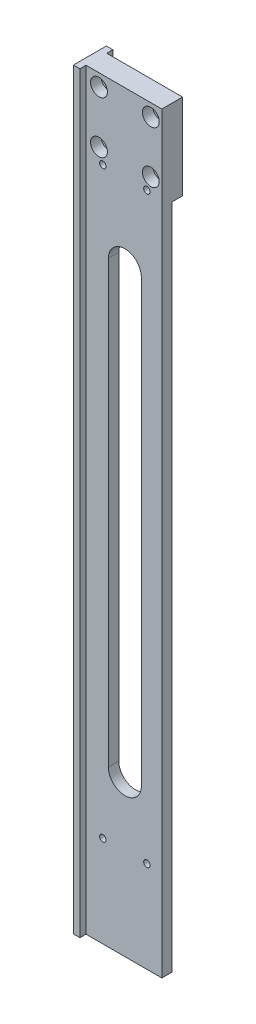
ISO-10303-21;
HEADER;
FILE_DESCRIPTION(('STEP AP214'),'2;1');
FILE_NAME('part.step','',(''),(''),'','','');
FILE_SCHEMA(('AUTOMOTIVE_DESIGN { 1 0 10303 214 1 1 1 1 }'));
ENDSEC;
DATA;
#1=APPLICATION_CONTEXT('core data for automotive mechanical design processes');
#2=APPLICATION_PROTOCOL_DEFINITION('international standard','automotive_design',2000,#1);
#3=PRODUCT_CONTEXT('',#1,'mechanical');
#4=PRODUCT('Part','Part','',(#3));
#5=PRODUCT_RELATED_PRODUCT_CATEGORY('part','',(#4));
#6=PRODUCT_DEFINITION_FORMATION('','',#4);
#7=PRODUCT_DEFINITION_CONTEXT('part definition',#1,'design');
#8=PRODUCT_DEFINITION('design','',#6,#7);
#9=PRODUCT_DEFINITION_SHAPE('','',#8);
#10=(LENGTH_UNIT() NAMED_UNIT(*) SI_UNIT(.MILLI.,.METRE.));
#11=(NAMED_UNIT(*) PLANE_ANGLE_UNIT() SI_UNIT($,.RADIAN.));
#12=(NAMED_UNIT(*) SI_UNIT($,.STERADIAN.) SOLID_ANGLE_UNIT());
#13=UNCERTAINTY_MEASURE_WITH_UNIT(LENGTH_MEASURE(1.E-05),#10,'distance_accuracy_value','');
#14=(GEOMETRIC_REPRESENTATION_CONTEXT(3) GLOBAL_UNCERTAINTY_ASSIGNED_CONTEXT((#13)) GLOBAL_UNIT_ASSIGNED_CONTEXT((#10,
#11,#12)) REPRESENTATION_CONTEXT('',''));
#15=CARTESIAN_POINT('',(0.,0.,0.));
#16=DIRECTION('',(0.,0.,1.));
#17=DIRECTION('',(1.,0.,0.));
#18=AXIS2_PLACEMENT_3D('',#15,#16,#17);
#19=CARTESIAN_POINT('',(0.,-145.15,8.));
#20=DIRECTION('',(0.,1.,0.));
#21=DIRECTION('',(0.,0.,1.));
#22=AXIS2_PLACEMENT_3D('',#19,#20,#21);
#23=PLANE('',#22);
#24=DIRECTION('',(0.,0.,-1.));
#25=VECTOR('',#24,1.);
#26=CARTESIAN_POINT('',(-17.5,-145.15,303.010764526567));
#27=LINE('',#26,#25);
#28=CARTESIAN_POINT('',(-17.5,-145.15,10.35));
#29=VERTEX_POINT('',#28);
#30=CARTESIAN_POINT('',(-17.5,-145.15,4.));
#31=VERTEX_POINT('',#30);
#32=EDGE_CURVE('E280',#29,#31,#27,.T.);
#33=ORIENTED_EDGE('',*,*,#32,.T.);
#34=DIRECTION('',(-1.,0.,0.));
#35=VECTOR('',#34,1.);
#36=CARTESIAN_POINT('',(14.25,-145.15,4.));
#37=LINE('',#36,#35);
#38=CARTESIAN_POINT('',(14.25,-145.15,4.));
#39=VERTEX_POINT('',#38);
#40=EDGE_CURVE('E151',#39,#31,#37,.T.);
#41=ORIENTED_EDGE('',*,*,#40,.F.);
#42=DIRECTION('',(0.,0.,1.));
#43=VECTOR('',#42,1.);
#44=CARTESIAN_POINT('',(14.25,-145.15,-2.35));
#45=LINE('',#44,#43);
#46=CARTESIAN_POINT('',(14.25,-145.15,8.));
#47=VERTEX_POINT('',#46);
#48=EDGE_CURVE('E189',#39,#47,#45,.T.);
#49=ORIENTED_EDGE('',*,*,#48,.T.);
#50=DIRECTION('',(1.,0.,0.));
#51=VECTOR('',#50,1.);
#52=CARTESIAN_POINT('',(0.,-145.15,8.));
#53=LINE('',#52,#51);
#54=CARTESIAN_POINT('',(-15.,-145.15,8.));
#55=VERTEX_POINT('',#54);
#56=EDGE_CURVE('E299',#55,#47,#53,.T.);
#57=ORIENTED_EDGE('',*,*,#56,.F.);
#58=DIRECTION('',(0.,0.,-1.));
#59=VECTOR('',#58,1.);
#60=CARTESIAN_POINT('',(-15.,-145.15,303.010764526567));
#61=LINE('',#60,#59);
#62=CARTESIAN_POINT('',(-15.,-145.15,10.35));
#63=VERTEX_POINT('',#62);
#64=EDGE_CURVE('E292',#63,#55,#61,.T.);
#65=ORIENTED_EDGE('',*,*,#64,.F.);
#66=DIRECTION('',(-1.,0.,0.));
#67=VECTOR('',#66,1.);
#68=CARTESIAN_POINT('',(0.,-145.15,10.35));
#69=LINE('',#68,#67);
#70=EDGE_CURVE('E278',#63,#29,#69,.T.);
#71=ORIENTED_EDGE('',*,*,#70,.T.);
#72=EDGE_LOOP('',(#33,#41,#49,#57,#65,#71));
#73=FACE_BOUND('',#72,.T.);
#74=ADVANCED_FACE('F42',(#73),#23,.F.);
#75=CARTESIAN_POINT('',(0.,145.15,8.));
#76=DIRECTION('',(0.,1.,0.));
#77=DIRECTION('',(0.,0.,1.));
#78=AXIS2_PLACEMENT_3D('',#75,#76,#77);
#79=PLANE('',#78);
#80=DIRECTION('',(0.,0.,1.));
#81=VECTOR('',#80,1.);
#82=CARTESIAN_POINT('',(14.25,145.15,-2.35));
#83=LINE('',#82,#81);
#84=CARTESIAN_POINT('',(14.25,145.15,0.));
#85=VERTEX_POINT('',#84);
#86=CARTESIAN_POINT('',(14.25,145.15,8.));
#87=VERTEX_POINT('',#86);
#88=EDGE_CURVE('E188',#85,#87,#83,.T.);
#89=ORIENTED_EDGE('',*,*,#88,.F.);
#90=DIRECTION('',(1.,0.,0.));
#91=VECTOR('',#90,1.);
#92=CARTESIAN_POINT('',(0.,145.15,0.));
#93=LINE('',#92,#91);
#94=CARTESIAN_POINT('',(-15.,145.15,0.));
#95=VERTEX_POINT('',#94);
#96=EDGE_CURVE('E285',#95,#85,#93,.T.);
#97=ORIENTED_EDGE('',*,*,#96,.F.);
#98=DIRECTION('',(0.,0.,1.));
#99=VECTOR('',#98,1.);
#100=CARTESIAN_POINT('',(-15.,145.15,-2.35));
#101=LINE('',#100,#99);
#102=CARTESIAN_POINT('',(-15.,145.15,-2.35));
#103=VERTEX_POINT('',#102);
#104=EDGE_CURVE('E273',#103,#95,#101,.T.);
#105=ORIENTED_EDGE('',*,*,#104,.F.);
#106=DIRECTION('',(-1.,0.,0.));
#107=VECTOR('',#106,1.);
#108=CARTESIAN_POINT('',(-1.61148872024342E-12,145.15,-2.35));
#109=LINE('',#108,#107);
#110=CARTESIAN_POINT('',(-17.5,145.15,-2.35));
#111=VERTEX_POINT('',#110);
#112=EDGE_CURVE('E266',#103,#111,#109,.T.);
#113=ORIENTED_EDGE('',*,*,#112,.T.);
#114=DIRECTION('',(0.,0.,-1.));
#115=VECTOR('',#114,1.);
#116=CARTESIAN_POINT('',(-17.5,145.15,303.010764526567));
#117=LINE('',#116,#115);
#118=CARTESIAN_POINT('',(-17.5,145.15,10.35));
#119=VERTEX_POINT('',#118);
#120=EDGE_CURVE('E281',#119,#111,#117,.T.);
#121=ORIENTED_EDGE('',*,*,#120,.F.);
#122=DIRECTION('',(-1.,0.,0.));
#123=VECTOR('',#122,1.);
#124=CARTESIAN_POINT('',(-1.61148872024342E-12,145.15,10.35));
#125=LINE('',#124,#123);
#126=CARTESIAN_POINT('',(-15.,145.15,10.35));
#127=VERTEX_POINT('',#126);
#128=EDGE_CURVE('E286',#127,#119,#125,.T.);
#129=ORIENTED_EDGE('',*,*,#128,.F.);
#130=DIRECTION('',(0.,0.,-1.));
#131=VECTOR('',#130,1.);
#132=CARTESIAN_POINT('',(-15.,145.15,303.010764526567));
#133=LINE('',#132,#131);
#134=CARTESIAN_POINT('',(-15.,145.15,8.00000000000001));
#135=VERTEX_POINT('',#134);
#136=EDGE_CURVE('E277',#127,#135,#133,.T.);
#137=ORIENTED_EDGE('',*,*,#136,.T.);
#138=DIRECTION('',(1.,0.,0.));
#139=VECTOR('',#138,1.);
#140=CARTESIAN_POINT('',(0.,145.15,8.));
#141=LINE('',#140,#139);
#142=EDGE_CURVE('E302',#135,#87,#141,.T.);
#143=ORIENTED_EDGE('',*,*,#142,.T.);
#144=EDGE_LOOP('',(#89,#97,#105,#113,#121,#129,#137,#143));
#145=FACE_BOUND('',#144,.T.);
#146=ADVANCED_FACE('F331',(#145),#79,.T.);
#147=CARTESIAN_POINT('',(0.,0.,8.));
#148=DIRECTION('',(0.,0.,1.));
#149=DIRECTION('',(1.,0.,0.));
#150=AXIS2_PLACEMENT_3D('',#147,#148,#149);
#151=PLANE('',#150);
#152=DIRECTION('',(0.,-1.,0.));
#153=VECTOR('',#152,1.);
#154=CARTESIAN_POINT('',(14.25,145.15,8.));
#155=LINE('',#154,#153);
#156=EDGE_CURVE('E185',#87,#47,#155,.T.);
#157=ORIENTED_EDGE('',*,*,#156,.F.);
#158=ORIENTED_EDGE('',*,*,#142,.F.);
#159=DIRECTION('',(0.,1.,0.));
#160=VECTOR('',#159,1.);
#161=CARTESIAN_POINT('',(-15.,0.,8.));
#162=LINE('',#161,#160);
#163=EDGE_CURVE('E305',#55,#135,#162,.T.);
#164=ORIENTED_EDGE('',*,*,#163,.F.);
#165=ORIENTED_EDGE('',*,*,#56,.T.);
#166=EDGE_LOOP('',(#157,#158,#164,#165));
#167=FACE_BOUND('',#166,.T.);
#168=CARTESIAN_POINT('',(0.,-85.,8.));
#169=DIRECTION('',(0.,0.,1.));
#170=DIRECTION('',(1.,0.,0.));
#171=AXIS2_PLACEMENT_3D('',#168,#169,#170);
#172=CIRCLE('',#171,6.35000000000003);
#173=CARTESIAN_POINT('',(-6.35000000000003,-85.,8.));
#174=VERTEX_POINT('',#173);
#175=CARTESIAN_POINT('',(6.35000000000003,-85.,8.));
#176=VERTEX_POINT('',#175);
#177=EDGE_CURVE('E191',#174,#176,#172,.T.);
#178=ORIENTED_EDGE('',*,*,#177,.F.);
#179=DIRECTION('',(0.,-1.,0.));
#180=VECTOR('',#179,1.);
#181=CARTESIAN_POINT('',(-6.35000000000003,-85.,8.));
#182=LINE('',#181,#180);
#183=CARTESIAN_POINT('',(-6.35000000000006,85.,8.));
#184=VERTEX_POINT('',#183);
#185=EDGE_CURVE('E201',#184,#174,#182,.T.);
#186=ORIENTED_EDGE('',*,*,#185,.F.);
#187=CARTESIAN_POINT('',(0.,85.,8.));
#188=DIRECTION('',(0.,0.,1.));
#189=DIRECTION('',(1.,0.,0.));
#190=AXIS2_PLACEMENT_3D('',#187,#188,#189);
#191=CIRCLE('',#190,6.35000000000003);
#192=CARTESIAN_POINT('',(6.35,85.,8.));
#193=VERTEX_POINT('',#192);
#194=EDGE_CURVE('E198',#193,#184,#191,.T.);
#195=ORIENTED_EDGE('',*,*,#194,.F.);
#196=DIRECTION('',(0.,1.,0.));
#197=VECTOR('',#196,1.);
#198=CARTESIAN_POINT('',(6.35000000000003,-85.,8.));
#199=LINE('',#198,#197);
#200=EDGE_CURVE('E195',#176,#193,#199,.T.);
#201=ORIENTED_EDGE('',*,*,#200,.F.);
#202=EDGE_LOOP('',(#178,#186,#195,#201));
#203=FACE_BOUND('',#202,.T.);
#204=CARTESIAN_POINT('',(-8.49999999999999,115.15,8.));
#205=DIRECTION('',(0.,0.,1.));
#206=DIRECTION('',(1.,0.,0.));
#207=AXIS2_PLACEMENT_3D('',#204,#205,#206);
#208=CIRCLE('',#207,1.25);
#209=CARTESIAN_POINT('',(-7.25,115.15,8.));
#210=VERTEX_POINT('',#209);
#211=EDGE_CURVE('E207',#210,#210,#208,.T.);
#212=ORIENTED_EDGE('',*,*,#211,.F.);
#213=EDGE_LOOP('',(#212));
#214=FACE_BOUND('',#213,.T.);
#215=CARTESIAN_POINT('',(8.50000000000005,115.15,8.));
#216=DIRECTION('',(0.,0.,1.));
#217=DIRECTION('',(1.,0.,0.));
#218=AXIS2_PLACEMENT_3D('',#215,#216,#217);
#219=CIRCLE('',#218,1.25);
#220=CARTESIAN_POINT('',(9.75000000000005,115.15,8.));
#221=VERTEX_POINT('',#220);
#222=EDGE_CURVE('E216',#221,#221,#219,.T.);
#223=ORIENTED_EDGE('',*,*,#222,.F.);
#224=EDGE_LOOP('',(#223));
#225=FACE_BOUND('',#224,.T.);
#226=CARTESIAN_POINT('',(8.5,-109.85,8.));
#227=DIRECTION('',(0.,0.,1.));
#228=DIRECTION('',(1.,0.,0.));
#229=AXIS2_PLACEMENT_3D('',#226,#227,#228);
#230=CIRCLE('',#229,1.25);
#231=CARTESIAN_POINT('',(9.75,-109.85,8.));
#232=VERTEX_POINT('',#231);
#233=EDGE_CURVE('E220',#232,#232,#230,.T.);
#234=ORIENTED_EDGE('',*,*,#233,.F.);
#235=EDGE_LOOP('',(#234));
#236=FACE_BOUND('',#235,.T.);
#237=CARTESIAN_POINT('',(-8.5,-109.85,8.));
#238=DIRECTION('',(0.,0.,1.));
#239=DIRECTION('',(1.,0.,0.));
#240=AXIS2_PLACEMENT_3D('',#237,#238,#239);
#241=CIRCLE('',#240,1.25);
#242=CARTESIAN_POINT('',(-7.25,-109.85,8.));
#243=VERTEX_POINT('',#242);
#244=EDGE_CURVE('E223',#243,#243,#241,.T.);
#245=ORIENTED_EDGE('',*,*,#244,.F.);
#246=EDGE_LOOP('',(#245));
#247=FACE_BOUND('',#246,.T.);
#248=CARTESIAN_POINT('',(-10.,140.35,8.));
#249=DIRECTION('',(0.,0.,1.));
#250=DIRECTION('',(1.,0.,0.));
#251=AXIS2_PLACEMENT_3D('',#248,#249,#250);
#252=CIRCLE('',#251,3.25);
#253=CARTESIAN_POINT('',(-6.75,140.35,8.));
#254=VERTEX_POINT('',#253);
#255=EDGE_CURVE('E226',#254,#254,#252,.T.);
#256=ORIENTED_EDGE('',*,*,#255,.F.);
#257=EDGE_LOOP('',(#256));
#258=FACE_BOUND('',#257,.T.);
#259=CARTESIAN_POINT('',(10.,140.35,8.));
#260=DIRECTION('',(0.,0.,1.));
#261=DIRECTION('',(1.,0.,0.));
#262=AXIS2_PLACEMENT_3D('',#259,#260,#261);
#263=CIRCLE('',#262,3.25);
#264=CARTESIAN_POINT('',(13.25,140.35,8.));
#265=VERTEX_POINT('',#264);
#266=EDGE_CURVE('E236',#265,#265,#263,.T.);
#267=ORIENTED_EDGE('',*,*,#266,.F.);
#268=EDGE_LOOP('',(#267));
#269=FACE_BOUND('',#268,.T.);
#270=CARTESIAN_POINT('',(10.,120.35,8.));
#271=DIRECTION('',(0.,0.,1.));
#272=DIRECTION('',(1.,0.,0.));
#273=AXIS2_PLACEMENT_3D('',#270,#271,#272);
#274=CIRCLE('',#273,3.25);
#275=CARTESIAN_POINT('',(13.25,120.35,8.));
#276=VERTEX_POINT('',#275);
#277=EDGE_CURVE('E246',#276,#276,#274,.T.);
#278=ORIENTED_EDGE('',*,*,#277,.F.);
#279=EDGE_LOOP('',(#278));
#280=FACE_BOUND('',#279,.T.);
#281=CARTESIAN_POINT('',(-10.,120.35,8.));
#282=DIRECTION('',(0.,0.,1.));
#283=DIRECTION('',(1.,0.,0.));
#284=AXIS2_PLACEMENT_3D('',#281,#282,#283);
#285=CIRCLE('',#284,3.25);
#286=CARTESIAN_POINT('',(-6.75,120.35,8.));
#287=VERTEX_POINT('',#286);
#288=EDGE_CURVE('E256',#287,#287,#285,.T.);
#289=ORIENTED_EDGE('',*,*,#288,.F.);
#290=EDGE_LOOP('',(#289));
#291=FACE_BOUND('',#290,.T.);
#292=ADVANCED_FACE('F336',(#167,#203,#214,#225,#236,#247,#258,#269,#280,#291),#151,.T.);
#293=CARTESIAN_POINT('',(0.,0.,0.));
#294=DIRECTION('',(0.,0.,1.));
#295=DIRECTION('',(1.,0.,0.));
#296=AXIS2_PLACEMENT_3D('',#293,#294,#295);
#297=PLANE('',#296);
#298=CARTESIAN_POINT('',(-8.49999999999999,115.15,0.));
#299=DIRECTION('',(0.,0.,1.));
#300=DIRECTION('',(1.,0.,0.));
#301=AXIS2_PLACEMENT_3D('',#298,#299,#300);
#302=CIRCLE('',#301,1.25);
#303=CARTESIAN_POINT('',(-7.25,115.15,0.));
#304=VERTEX_POINT('',#303);
#305=EDGE_CURVE('E215',#304,#304,#302,.T.);
#306=ORIENTED_EDGE('',*,*,#305,.T.);
#307=EDGE_LOOP('',(#306));
#308=FACE_BOUND('',#307,.T.);
#309=CARTESIAN_POINT('',(8.50000000000005,115.15,0.));
#310=DIRECTION('',(0.,0.,1.));
#311=DIRECTION('',(1.,0.,0.));
#312=AXIS2_PLACEMENT_3D('',#309,#310,#311);
#313=CIRCLE('',#312,1.25);
#314=CARTESIAN_POINT('',(9.75000000000005,115.15,0.));
#315=VERTEX_POINT('',#314);
#316=EDGE_CURVE('E219',#315,#315,#313,.T.);
#317=ORIENTED_EDGE('',*,*,#316,.T.);
#318=EDGE_LOOP('',(#317));
#319=FACE_BOUND('',#318,.T.);
#320=CARTESIAN_POINT('',(-10.,140.35,0.));
#321=DIRECTION('',(0.,0.,1.));
#322=DIRECTION('',(1.,0.,0.));
#323=AXIS2_PLACEMENT_3D('',#320,#321,#322);
#324=CIRCLE('',#323,1.8);
#325=CARTESIAN_POINT('',(-8.2,140.35,0.));
#326=VERTEX_POINT('',#325);
#327=EDGE_CURVE('E235',#326,#326,#324,.T.);
#328=ORIENTED_EDGE('',*,*,#327,.T.);
#329=EDGE_LOOP('',(#328));
#330=FACE_BOUND('',#329,.T.);
#331=CARTESIAN_POINT('',(10.,140.35,0.));
#332=DIRECTION('',(0.,0.,1.));
#333=DIRECTION('',(1.,0.,0.));
#334=AXIS2_PLACEMENT_3D('',#331,#332,#333);
#335=CIRCLE('',#334,1.8);
#336=CARTESIAN_POINT('',(11.8,140.35,0.));
#337=VERTEX_POINT('',#336);
#338=EDGE_CURVE('E245',#337,#337,#335,.T.);
#339=ORIENTED_EDGE('',*,*,#338,.T.);
#340=EDGE_LOOP('',(#339));
#341=FACE_BOUND('',#340,.T.);
#342=CARTESIAN_POINT('',(10.,120.35,0.));
#343=DIRECTION('',(0.,0.,1.));
#344=DIRECTION('',(1.,0.,0.));
#345=AXIS2_PLACEMENT_3D('',#342,#343,#344);
#346=CIRCLE('',#345,1.8);
#347=CARTESIAN_POINT('',(11.8,120.35,0.));
#348=VERTEX_POINT('',#347);
#349=EDGE_CURVE('E255',#348,#348,#346,.T.);
#350=ORIENTED_EDGE('',*,*,#349,.T.);
#351=EDGE_LOOP('',(#350));
#352=FACE_BOUND('',#351,.T.);
#353=CARTESIAN_POINT('',(-10.,120.35,0.));
#354=DIRECTION('',(0.,0.,1.));
#355=DIRECTION('',(1.,0.,0.));
#356=AXIS2_PLACEMENT_3D('',#353,#354,#355);
#357=CIRCLE('',#356,1.8);
#358=CARTESIAN_POINT('',(-8.2,120.35,0.));
#359=VERTEX_POINT('',#358);
#360=EDGE_CURVE('E265',#359,#359,#357,.T.);
#361=ORIENTED_EDGE('',*,*,#360,.T.);
#362=EDGE_LOOP('',(#361));
#363=FACE_BOUND('',#362,.T.);
#364=DIRECTION('',(0.,-1.,0.));
#365=VECTOR('',#364,1.);
#366=CARTESIAN_POINT('',(14.25,0.,0.));
#367=LINE('',#366,#365);
#368=CARTESIAN_POINT('',(14.25,112.15,0.));
#369=VERTEX_POINT('',#368);
#370=EDGE_CURVE('E49',#85,#369,#367,.T.);
#371=ORIENTED_EDGE('',*,*,#370,.T.);
#372=DIRECTION('',(-1.,0.,0.));
#373=VECTOR('',#372,1.);
#374=CARTESIAN_POINT('',(0.,112.15,0.));
#375=LINE('',#374,#373);
#376=CARTESIAN_POINT('',(-15.,112.15,0.));
#377=VERTEX_POINT('',#376);
#378=EDGE_CURVE('E182',#369,#377,#375,.T.);
#379=ORIENTED_EDGE('',*,*,#378,.T.);
#380=DIRECTION('',(0.,1.,0.));
#381=VECTOR('',#380,1.);
#382=CARTESIAN_POINT('',(-15.,0.,0.));
#383=LINE('',#382,#381);
#384=EDGE_CURVE('E269',#377,#95,#383,.T.);
#385=ORIENTED_EDGE('',*,*,#384,.T.);
#386=ORIENTED_EDGE('',*,*,#96,.T.);
#387=EDGE_LOOP('',(#371,#379,#385,#386));
#388=FACE_BOUND('',#387,.T.);
#389=ADVANCED_FACE('F323',(#308,#319,#330,#341,#352,#363,#388),#297,.F.);
#390=CARTESIAN_POINT('',(-15.,0.,303.010764526567));
#391=DIRECTION('',(-1.,0.,0.));
#392=DIRECTION('',(0.,-1.,0.));
#393=AXIS2_PLACEMENT_3D('',#390,#391,#392);
#394=PLANE('',#393);
#395=ORIENTED_EDGE('',*,*,#64,.T.);
#396=ORIENTED_EDGE('',*,*,#163,.T.);
#397=ORIENTED_EDGE('',*,*,#136,.F.);
#398=DIRECTION('',(0.,1.,0.));
#399=VECTOR('',#398,1.);
#400=CARTESIAN_POINT('',(-15.,0.,10.35));
#401=LINE('',#400,#399);
#402=EDGE_CURVE('E289',#63,#127,#401,.T.);
#403=ORIENTED_EDGE('',*,*,#402,.F.);
#404=EDGE_LOOP('',(#395,#396,#397,#403));
#405=FACE_BOUND('',#404,.T.);
#406=ADVANCED_FACE('F339',(#405),#394,.F.);
#407=CARTESIAN_POINT('',(-17.5,0.,303.010764526567));
#408=DIRECTION('',(1.,0.,0.));
#409=DIRECTION('',(0.,1.,0.));
#410=AXIS2_PLACEMENT_3D('',#407,#408,#409);
#411=PLANE('',#410);
#412=DIRECTION('',(0.,-1.,0.));
#413=VECTOR('',#412,1.);
#414=CARTESIAN_POINT('',(-17.5,0.,-2.35));
#415=LINE('',#414,#413);
#416=CARTESIAN_POINT('',(-17.5,112.15,-2.35000000000002));
#417=VERTEX_POINT('',#416);
#418=EDGE_CURVE('E159',#111,#417,#415,.T.);
#419=ORIENTED_EDGE('',*,*,#418,.T.);
#420=DIRECTION('',(0.,0.,1.));
#421=VECTOR('',#420,1.);
#422=CARTESIAN_POINT('',(-17.5,112.15,-261.601523621367));
#423=LINE('',#422,#421);
#424=CARTESIAN_POINT('',(-17.5,112.15,4.));
#425=VERTEX_POINT('',#424);
#426=EDGE_CURVE('E142',#417,#425,#423,.T.);
#427=ORIENTED_EDGE('',*,*,#426,.T.);
#428=DIRECTION('',(0.,1.,0.));
#429=VECTOR('',#428,1.);
#430=CARTESIAN_POINT('',(-17.5,-145.15,4.));
#431=LINE('',#430,#429);
#432=EDGE_CURVE('E145',#31,#425,#431,.T.);
#433=ORIENTED_EDGE('',*,*,#432,.F.);
#434=ORIENTED_EDGE('',*,*,#32,.F.);
#435=DIRECTION('',(0.,-1.,0.));
#436=VECTOR('',#435,1.);
#437=CARTESIAN_POINT('',(-17.5,0.,10.35));
#438=LINE('',#437,#436);
#439=EDGE_CURVE('E282',#119,#29,#438,.T.);
#440=ORIENTED_EDGE('',*,*,#439,.F.);
#441=ORIENTED_EDGE('',*,*,#120,.T.);
#442=EDGE_LOOP('',(#419,#427,#433,#434,#440,#441));
#443=FACE_BOUND('',#442,.T.);
#444=ADVANCED_FACE('F157',(#443),#411,.F.);
#445=CARTESIAN_POINT('',(0.,0.,10.35));
#446=DIRECTION('',(0.,0.,1.));
#447=DIRECTION('',(1.,0.,0.));
#448=AXIS2_PLACEMENT_3D('',#445,#446,#447);
#449=PLANE('',#448);
#450=ORIENTED_EDGE('',*,*,#402,.T.);
#451=ORIENTED_EDGE('',*,*,#128,.T.);
#452=ORIENTED_EDGE('',*,*,#439,.T.);
#453=ORIENTED_EDGE('',*,*,#70,.F.);
#454=EDGE_LOOP('',(#450,#451,#452,#453));
#455=FACE_BOUND('',#454,.T.);
#456=ADVANCED_FACE('F347',(#455),#449,.T.);
#457=CARTESIAN_POINT('',(-15.,0.,-2.35));
#458=DIRECTION('',(1.,0.,0.));
#459=DIRECTION('',(0.,1.,0.));
#460=AXIS2_PLACEMENT_3D('',#457,#458,#459);
#461=PLANE('',#460);
#462=DIRECTION('',(0.,0.,1.));
#463=VECTOR('',#462,1.);
#464=CARTESIAN_POINT('',(-15.,112.15,-2.35));
#465=LINE('',#464,#463);
#466=CARTESIAN_POINT('',(-15.,112.15,-2.35000000000002));
#467=VERTEX_POINT('',#466);
#468=EDGE_CURVE('E180',#467,#377,#465,.T.);
#469=ORIENTED_EDGE('',*,*,#468,.F.);
#470=DIRECTION('',(0.,1.,0.));
#471=VECTOR('',#470,1.);
#472=CARTESIAN_POINT('',(-15.,0.,-2.35));
#473=LINE('',#472,#471);
#474=EDGE_CURVE('E271',#467,#103,#473,.T.);
#475=ORIENTED_EDGE('',*,*,#474,.T.);
#476=ORIENTED_EDGE('',*,*,#104,.T.);
#477=ORIENTED_EDGE('',*,*,#384,.F.);
#478=EDGE_LOOP('',(#469,#475,#476,#477));
#479=FACE_BOUND('',#478,.T.);
#480=ADVANCED_FACE('F354',(#479),#461,.T.);
#481=CARTESIAN_POINT('',(0.,0.,-2.35));
#482=DIRECTION('',(0.,0.,1.));
#483=DIRECTION('',(1.,0.,0.));
#484=AXIS2_PLACEMENT_3D('',#481,#482,#483);
#485=PLANE('',#484);
#486=ORIENTED_EDGE('',*,*,#474,.F.);
#487=DIRECTION('',(1.,0.,0.));
#488=VECTOR('',#487,1.);
#489=CARTESIAN_POINT('',(14.25,112.15,-2.35000000000002));
#490=LINE('',#489,#488);
#491=EDGE_CURVE('E160',#417,#467,#490,.T.);
#492=ORIENTED_EDGE('',*,*,#491,.F.);
#493=ORIENTED_EDGE('',*,*,#418,.F.);
#494=ORIENTED_EDGE('',*,*,#112,.F.);
#495=EDGE_LOOP('',(#486,#492,#493,#494));
#496=FACE_BOUND('',#495,.T.);
#497=ADVANCED_FACE('F351',(#496),#485,.F.);
#498=CARTESIAN_POINT('',(-10.,120.35,8.));
#499=DIRECTION('',(0.,0.,1.));
#500=DIRECTION('',(1.,0.,0.));
#501=AXIS2_PLACEMENT_3D('',#498,#499,#500);
#502=CYLINDRICAL_SURFACE('',#501,1.8);
#503=CARTESIAN_POINT('',(-10.,120.35,4.));
#504=DIRECTION('',(0.,0.,1.));
#505=DIRECTION('',(1.,0.,0.));
#506=AXIS2_PLACEMENT_3D('',#503,#504,#505);
#507=CIRCLE('',#506,1.8);
#508=CARTESIAN_POINT('',(-8.2,120.35,4.));
#509=VERTEX_POINT('',#508);
#510=EDGE_CURVE('E262',#509,#509,#507,.T.);
#511=ORIENTED_EDGE('',*,*,#510,.T.);
#512=EDGE_LOOP('',(#511));
#513=FACE_BOUND('',#512,.T.);
#514=ORIENTED_EDGE('',*,*,#360,.F.);
#515=EDGE_LOOP('',(#514));
#516=FACE_BOUND('',#515,.T.);
#517=ADVANCED_FACE('F361',(#513,#516),#502,.F.);
#518=CARTESIAN_POINT('',(-8.2,120.35,4.));
#519=DIRECTION('',(0.,0.,-1.));
#520=DIRECTION('',(-1.,0.,0.));
#521=AXIS2_PLACEMENT_3D('',#518,#519,#520);
#522=PLANE('',#521);
#523=ORIENTED_EDGE('',*,*,#510,.F.);
#524=EDGE_LOOP('',(#523));
#525=FACE_BOUND('',#524,.T.);
#526=CARTESIAN_POINT('',(-10.,120.35,4.));
#527=DIRECTION('',(0.,0.,1.));
#528=DIRECTION('',(1.,0.,0.));
#529=AXIS2_PLACEMENT_3D('',#526,#527,#528);
#530=CIRCLE('',#529,3.25);
#531=CARTESIAN_POINT('',(-6.75,120.35,4.));
#532=VERTEX_POINT('',#531);
#533=EDGE_CURVE('E259',#532,#532,#530,.T.);
#534=ORIENTED_EDGE('',*,*,#533,.T.);
#535=EDGE_LOOP('',(#534));
#536=FACE_BOUND('',#535,.T.);
#537=ADVANCED_FACE('F402',(#525,#536),#522,.F.);
#538=CARTESIAN_POINT('',(-10.,120.35,8.));
#539=DIRECTION('',(0.,0.,1.));
#540=DIRECTION('',(1.,0.,0.));
#541=AXIS2_PLACEMENT_3D('',#538,#539,#540);
#542=CYLINDRICAL_SURFACE('',#541,3.25);
#543=ORIENTED_EDGE('',*,*,#533,.F.);
#544=EDGE_LOOP('',(#543));
#545=FACE_BOUND('',#544,.T.);
#546=ORIENTED_EDGE('',*,*,#288,.T.);
#547=EDGE_LOOP('',(#546));
#548=FACE_BOUND('',#547,.T.);
#549=ADVANCED_FACE('F413',(#545,#548),#542,.F.);
#550=CARTESIAN_POINT('',(10.,120.35,8.));
#551=DIRECTION('',(0.,0.,1.));
#552=DIRECTION('',(1.,0.,0.));
#553=AXIS2_PLACEMENT_3D('',#550,#551,#552);
#554=CYLINDRICAL_SURFACE('',#553,1.8);
#555=CARTESIAN_POINT('',(10.,120.35,4.));
#556=DIRECTION('',(0.,0.,1.));
#557=DIRECTION('',(1.,0.,0.));
#558=AXIS2_PLACEMENT_3D('',#555,#556,#557);
#559=CIRCLE('',#558,1.8);
#560=CARTESIAN_POINT('',(11.8,120.35,4.));
#561=VERTEX_POINT('',#560);
#562=EDGE_CURVE('E252',#561,#561,#559,.T.);
#563=ORIENTED_EDGE('',*,*,#562,.T.);
#564=EDGE_LOOP('',(#563));
#565=FACE_BOUND('',#564,.T.);
#566=ORIENTED_EDGE('',*,*,#349,.F.);
#567=EDGE_LOOP('',(#566));
#568=FACE_BOUND('',#567,.T.);
#569=ADVANCED_FACE('F423',(#565,#568),#554,.F.);
#570=CARTESIAN_POINT('',(11.8,120.35,4.));
#571=DIRECTION('',(0.,0.,-1.));
#572=DIRECTION('',(-1.,0.,0.));
#573=AXIS2_PLACEMENT_3D('',#570,#571,#572);
#574=PLANE('',#573);
#575=ORIENTED_EDGE('',*,*,#562,.F.);
#576=EDGE_LOOP('',(#575));
#577=FACE_BOUND('',#576,.T.);
#578=CARTESIAN_POINT('',(10.,120.35,4.));
#579=DIRECTION('',(0.,0.,1.));
#580=DIRECTION('',(1.,0.,0.));
#581=AXIS2_PLACEMENT_3D('',#578,#579,#580);
#582=CIRCLE('',#581,3.25);
#583=CARTESIAN_POINT('',(13.25,120.35,4.));
#584=VERTEX_POINT('',#583);
#585=EDGE_CURVE('E249',#584,#584,#582,.T.);
#586=ORIENTED_EDGE('',*,*,#585,.T.);
#587=EDGE_LOOP('',(#586));
#588=FACE_BOUND('',#587,.T.);
#589=ADVANCED_FACE('F433',(#577,#588),#574,.F.);
#590=CARTESIAN_POINT('',(10.,120.35,8.));
#591=DIRECTION('',(0.,0.,1.));
#592=DIRECTION('',(1.,0.,0.));
#593=AXIS2_PLACEMENT_3D('',#590,#591,#592);
#594=CYLINDRICAL_SURFACE('',#593,3.25);
#595=ORIENTED_EDGE('',*,*,#585,.F.);
#596=EDGE_LOOP('',(#595));
#597=FACE_BOUND('',#596,.T.);
#598=ORIENTED_EDGE('',*,*,#277,.T.);
#599=EDGE_LOOP('',(#598));
#600=FACE_BOUND('',#599,.T.);
#601=ADVANCED_FACE('F443',(#597,#600),#594,.F.);
#602=CARTESIAN_POINT('',(10.,140.35,8.));
#603=DIRECTION('',(0.,0.,1.));
#604=DIRECTION('',(1.,0.,0.));
#605=AXIS2_PLACEMENT_3D('',#602,#603,#604);
#606=CYLINDRICAL_SURFACE('',#605,1.8);
#607=CARTESIAN_POINT('',(10.,140.35,4.));
#608=DIRECTION('',(0.,0.,1.));
#609=DIRECTION('',(1.,0.,0.));
#610=AXIS2_PLACEMENT_3D('',#607,#608,#609);
#611=CIRCLE('',#610,1.8);
#612=CARTESIAN_POINT('',(11.8,140.35,4.));
#613=VERTEX_POINT('',#612);
#614=EDGE_CURVE('E242',#613,#613,#611,.T.);
#615=ORIENTED_EDGE('',*,*,#614,.T.);
#616=EDGE_LOOP('',(#615));
#617=FACE_BOUND('',#616,.T.);
#618=ORIENTED_EDGE('',*,*,#338,.F.);
#619=EDGE_LOOP('',(#618));
#620=FACE_BOUND('',#619,.T.);
#621=ADVANCED_FACE('F453',(#617,#620),#606,.F.);
#622=CARTESIAN_POINT('',(11.8,140.35,4.));
#623=DIRECTION('',(0.,0.,-1.));
#624=DIRECTION('',(-1.,0.,0.));
#625=AXIS2_PLACEMENT_3D('',#622,#623,#624);
#626=PLANE('',#625);
#627=ORIENTED_EDGE('',*,*,#614,.F.);
#628=EDGE_LOOP('',(#627));
#629=FACE_BOUND('',#628,.T.);
#630=CARTESIAN_POINT('',(10.,140.35,4.));
#631=DIRECTION('',(0.,0.,1.));
#632=DIRECTION('',(1.,0.,0.));
#633=AXIS2_PLACEMENT_3D('',#630,#631,#632);
#634=CIRCLE('',#633,3.25);
#635=CARTESIAN_POINT('',(13.25,140.35,4.));
#636=VERTEX_POINT('',#635);
#637=EDGE_CURVE('E239',#636,#636,#634,.T.);
#638=ORIENTED_EDGE('',*,*,#637,.T.);
#639=EDGE_LOOP('',(#638));
#640=FACE_BOUND('',#639,.T.);
#641=ADVANCED_FACE('F463',(#629,#640),#626,.F.);
#642=CARTESIAN_POINT('',(10.,140.35,8.));
#643=DIRECTION('',(0.,0.,1.));
#644=DIRECTION('',(1.,0.,0.));
#645=AXIS2_PLACEMENT_3D('',#642,#643,#644);
#646=CYLINDRICAL_SURFACE('',#645,3.25);
#647=ORIENTED_EDGE('',*,*,#637,.F.);
#648=EDGE_LOOP('',(#647));
#649=FACE_BOUND('',#648,.T.);
#650=ORIENTED_EDGE('',*,*,#266,.T.);
#651=EDGE_LOOP('',(#650));
#652=FACE_BOUND('',#651,.T.);
#653=ADVANCED_FACE('F473',(#649,#652),#646,.F.);
#654=CARTESIAN_POINT('',(-10.,140.35,8.));
#655=DIRECTION('',(0.,0.,1.));
#656=DIRECTION('',(1.,0.,0.));
#657=AXIS2_PLACEMENT_3D('',#654,#655,#656);
#658=CYLINDRICAL_SURFACE('',#657,1.8);
#659=CARTESIAN_POINT('',(-10.,140.35,4.));
#660=DIRECTION('',(0.,0.,1.));
#661=DIRECTION('',(1.,0.,0.));
#662=AXIS2_PLACEMENT_3D('',#659,#660,#661);
#663=CIRCLE('',#662,1.8);
#664=CARTESIAN_POINT('',(-8.2,140.35,4.));
#665=VERTEX_POINT('',#664);
#666=EDGE_CURVE('E232',#665,#665,#663,.T.);
#667=ORIENTED_EDGE('',*,*,#666,.T.);
#668=EDGE_LOOP('',(#667));
#669=FACE_BOUND('',#668,.T.);
#670=ORIENTED_EDGE('',*,*,#327,.F.);
#671=EDGE_LOOP('',(#670));
#672=FACE_BOUND('',#671,.T.);
#673=ADVANCED_FACE('F483',(#669,#672),#658,.F.);
#674=CARTESIAN_POINT('',(-8.2,140.35,4.));
#675=DIRECTION('',(0.,0.,-1.));
#676=DIRECTION('',(-1.,0.,0.));
#677=AXIS2_PLACEMENT_3D('',#674,#675,#676);
#678=PLANE('',#677);
#679=ORIENTED_EDGE('',*,*,#666,.F.);
#680=EDGE_LOOP('',(#679));
#681=FACE_BOUND('',#680,.T.);
#682=CARTESIAN_POINT('',(-10.,140.35,4.));
#683=DIRECTION('',(0.,0.,1.));
#684=DIRECTION('',(1.,0.,0.));
#685=AXIS2_PLACEMENT_3D('',#682,#683,#684);
#686=CIRCLE('',#685,3.25);
#687=CARTESIAN_POINT('',(-6.75,140.35,4.));
#688=VERTEX_POINT('',#687);
#689=EDGE_CURVE('E229',#688,#688,#686,.T.);
#690=ORIENTED_EDGE('',*,*,#689,.T.);
#691=EDGE_LOOP('',(#690));
#692=FACE_BOUND('',#691,.T.);
#693=ADVANCED_FACE('F493',(#681,#692),#678,.F.);
#694=CARTESIAN_POINT('',(-10.,140.35,8.));
#695=DIRECTION('',(0.,0.,1.));
#696=DIRECTION('',(1.,0.,0.));
#697=AXIS2_PLACEMENT_3D('',#694,#695,#696);
#698=CYLINDRICAL_SURFACE('',#697,3.25);
#699=ORIENTED_EDGE('',*,*,#689,.F.);
#700=EDGE_LOOP('',(#699));
#701=FACE_BOUND('',#700,.T.);
#702=ORIENTED_EDGE('',*,*,#255,.T.);
#703=EDGE_LOOP('',(#702));
#704=FACE_BOUND('',#703,.T.);
#705=ADVANCED_FACE('F503',(#701,#704),#698,.F.);
#706=CARTESIAN_POINT('',(-8.5,-109.85,8.));
#707=DIRECTION('',(0.,0.,1.));
#708=DIRECTION('',(1.,0.,0.));
#709=AXIS2_PLACEMENT_3D('',#706,#707,#708);
#710=CYLINDRICAL_SURFACE('',#709,1.25);
#711=CARTESIAN_POINT('',(-8.5,-109.85,4.));
#712=DIRECTION('',(0.,0.,1.));
#713=DIRECTION('',(1.,0.,0.));
#714=AXIS2_PLACEMENT_3D('',#711,#712,#713);
#715=CIRCLE('',#714,1.25);
#716=CARTESIAN_POINT('',(-7.25,-109.85,4.));
#717=VERTEX_POINT('',#716);
#718=EDGE_CURVE('E177',#717,#717,#715,.F.);
#719=ORIENTED_EDGE('',*,*,#718,.T.);
#720=EDGE_LOOP('',(#719));
#721=FACE_BOUND('',#720,.T.);
#722=ORIENTED_EDGE('',*,*,#244,.T.);
#723=EDGE_LOOP('',(#722));
#724=FACE_BOUND('',#723,.T.);
#725=ADVANCED_FACE('F513',(#721,#724),#710,.F.);
#726=CARTESIAN_POINT('',(8.5,-109.85,8.));
#727=DIRECTION('',(0.,0.,1.));
#728=DIRECTION('',(1.,0.,0.));
#729=AXIS2_PLACEMENT_3D('',#726,#727,#728);
#730=CYLINDRICAL_SURFACE('',#729,1.25);
#731=CARTESIAN_POINT('',(8.5,-109.85,4.));
#732=DIRECTION('',(0.,0.,1.));
#733=DIRECTION('',(1.,0.,0.));
#734=AXIS2_PLACEMENT_3D('',#731,#732,#733);
#735=CIRCLE('',#734,1.25);
#736=CARTESIAN_POINT('',(9.75,-109.85,4.));
#737=VERTEX_POINT('',#736);
#738=EDGE_CURVE('E174',#737,#737,#735,.F.);
#739=ORIENTED_EDGE('',*,*,#738,.T.);
#740=EDGE_LOOP('',(#739));
#741=FACE_BOUND('',#740,.T.);
#742=ORIENTED_EDGE('',*,*,#233,.T.);
#743=EDGE_LOOP('',(#742));
#744=FACE_BOUND('',#743,.T.);
#745=ADVANCED_FACE('F528',(#741,#744),#730,.F.);
#746=CARTESIAN_POINT('',(8.50000000000005,115.15,8.));
#747=DIRECTION('',(0.,0.,1.));
#748=DIRECTION('',(1.,0.,0.));
#749=AXIS2_PLACEMENT_3D('',#746,#747,#748);
#750=CYLINDRICAL_SURFACE('',#749,1.25);
#751=ORIENTED_EDGE('',*,*,#222,.T.);
#752=EDGE_LOOP('',(#751));
#753=FACE_BOUND('',#752,.T.);
#754=ORIENTED_EDGE('',*,*,#316,.F.);
#755=EDGE_LOOP('',(#754));
#756=FACE_BOUND('',#755,.T.);
#757=ADVANCED_FACE('F521',(#753,#756),#750,.F.);
#758=CARTESIAN_POINT('',(-8.49999999999999,115.15,8.));
#759=DIRECTION('',(0.,0.,1.));
#760=DIRECTION('',(1.,0.,0.));
#761=AXIS2_PLACEMENT_3D('',#758,#759,#760);
#762=CYLINDRICAL_SURFACE('',#761,1.25);
#763=ORIENTED_EDGE('',*,*,#211,.T.);
#764=EDGE_LOOP('',(#763));
#765=FACE_BOUND('',#764,.T.);
#766=ORIENTED_EDGE('',*,*,#305,.F.);
#767=EDGE_LOOP('',(#766));
#768=FACE_BOUND('',#767,.T.);
#769=ADVANCED_FACE('F527',(#765,#768),#762,.F.);
#770=CARTESIAN_POINT('',(0.,-85.,-2.));
#771=DIRECTION('',(0.,0.,1.));
#772=DIRECTION('',(1.,0.,0.));
#773=AXIS2_PLACEMENT_3D('',#770,#771,#772);
#774=CYLINDRICAL_SURFACE('',#773,6.35000000000003);
#775=DIRECTION('',(0.,0.,1.));
#776=VECTOR('',#775,1.);
#777=CARTESIAN_POINT('',(6.35000000000003,-85.,-2.));
#778=LINE('',#777,#776);
#779=CARTESIAN_POINT('',(6.35000000000003,-85.,4.));
#780=VERTEX_POINT('',#779);
#781=EDGE_CURVE('E204',#780,#176,#778,.T.);
#782=ORIENTED_EDGE('',*,*,#781,.F.);
#783=CARTESIAN_POINT('',(0.,-85.,4.));
#784=DIRECTION('',(0.,0.,1.));
#785=DIRECTION('',(1.,0.,0.));
#786=AXIS2_PLACEMENT_3D('',#783,#784,#785);
#787=CIRCLE('',#786,6.35000000000003);
#788=CARTESIAN_POINT('',(-6.35000000000003,-85.,4.));
#789=VERTEX_POINT('',#788);
#790=EDGE_CURVE('E56',#780,#789,#787,.F.);
#791=ORIENTED_EDGE('',*,*,#790,.T.);
#792=DIRECTION('',(0.,0.,1.));
#793=VECTOR('',#792,1.);
#794=CARTESIAN_POINT('',(-6.35000000000003,-85.,-2.));
#795=LINE('',#794,#793);
#796=EDGE_CURVE('E205',#789,#174,#795,.T.);
#797=ORIENTED_EDGE('',*,*,#796,.T.);
#798=ORIENTED_EDGE('',*,*,#177,.T.);
#799=EDGE_LOOP('',(#782,#791,#797,#798));
#800=FACE_BOUND('',#799,.T.);
#801=ADVANCED_FACE('F540',(#800),#774,.F.);
#802=CARTESIAN_POINT('',(-6.35000000000003,-85.,-2.));
#803=DIRECTION('',(-1.,0.,0.));
#804=DIRECTION('',(0.,-1.,0.));
#805=AXIS2_PLACEMENT_3D('',#802,#803,#804);
#806=PLANE('',#805);
#807=ORIENTED_EDGE('',*,*,#796,.F.);
#808=DIRECTION('',(0.,1.,0.));
#809=VECTOR('',#808,1.);
#810=CARTESIAN_POINT('',(-6.35000000000003,-85.,4.));
#811=LINE('',#810,#809);
#812=CARTESIAN_POINT('',(-6.35000000000006,85.,4.));
#813=VERTEX_POINT('',#812);
#814=EDGE_CURVE('E170',#789,#813,#811,.T.);
#815=ORIENTED_EDGE('',*,*,#814,.T.);
#816=DIRECTION('',(0.,0.,1.));
#817=VECTOR('',#816,1.);
#818=CARTESIAN_POINT('',(-6.35000000000006,85.,-2.));
#819=LINE('',#818,#817);
#820=EDGE_CURVE('E208',#813,#184,#819,.T.);
#821=ORIENTED_EDGE('',*,*,#820,.T.);
#822=ORIENTED_EDGE('',*,*,#185,.T.);
#823=EDGE_LOOP('',(#807,#815,#821,#822));
#824=FACE_BOUND('',#823,.T.);
#825=ADVANCED_FACE('F614',(#824),#806,.F.);
#826=CARTESIAN_POINT('',(0.,85.,-2.));
#827=DIRECTION('',(0.,0.,1.));
#828=DIRECTION('',(1.,0.,0.));
#829=AXIS2_PLACEMENT_3D('',#826,#827,#828);
#830=CYLINDRICAL_SURFACE('',#829,6.35000000000003);
#831=ORIENTED_EDGE('',*,*,#820,.F.);
#832=CARTESIAN_POINT('',(0.,85.,4.));
#833=DIRECTION('',(0.,0.,1.));
#834=DIRECTION('',(1.,0.,0.));
#835=AXIS2_PLACEMENT_3D('',#832,#833,#834);
#836=CIRCLE('',#835,6.35000000000003);
#837=CARTESIAN_POINT('',(6.35,85.,4.));
#838=VERTEX_POINT('',#837);
#839=EDGE_CURVE('E167',#813,#838,#836,.F.);
#840=ORIENTED_EDGE('',*,*,#839,.T.);
#841=DIRECTION('',(0.,0.,1.));
#842=VECTOR('',#841,1.);
#843=CARTESIAN_POINT('',(6.35,85.,-2.));
#844=LINE('',#843,#842);
#845=EDGE_CURVE('E210',#838,#193,#844,.T.);
#846=ORIENTED_EDGE('',*,*,#845,.T.);
#847=ORIENTED_EDGE('',*,*,#194,.T.);
#848=EDGE_LOOP('',(#831,#840,#846,#847));
#849=FACE_BOUND('',#848,.T.);
#850=ADVANCED_FACE('F624',(#849),#830,.F.);
#851=CARTESIAN_POINT('',(6.35000000000003,-85.,-2.));
#852=DIRECTION('',(1.,0.,0.));
#853=DIRECTION('',(0.,1.,0.));
#854=AXIS2_PLACEMENT_3D('',#851,#852,#853);
#855=PLANE('',#854);
#856=ORIENTED_EDGE('',*,*,#845,.F.);
#857=DIRECTION('',(0.,-1.,0.));
#858=VECTOR('',#857,1.);
#859=CARTESIAN_POINT('',(6.35000000000003,-85.,4.));
#860=LINE('',#859,#858);
#861=EDGE_CURVE('E162',#838,#780,#860,.T.);
#862=ORIENTED_EDGE('',*,*,#861,.T.);
#863=ORIENTED_EDGE('',*,*,#781,.T.);
#864=ORIENTED_EDGE('',*,*,#200,.T.);
#865=EDGE_LOOP('',(#856,#862,#863,#864));
#866=FACE_BOUND('',#865,.T.);
#867=ADVANCED_FACE('F634',(#866),#855,.F.);
#868=CARTESIAN_POINT('',(14.25,145.15,-2.35));
#869=DIRECTION('',(-1.,0.,0.));
#870=DIRECTION('',(0.,-1.,0.));
#871=AXIS2_PLACEMENT_3D('',#868,#869,#870);
#872=PLANE('',#871);
#873=DIRECTION('',(0.,1.,0.));
#874=VECTOR('',#873,1.);
#875=CARTESIAN_POINT('',(14.25,-145.15,4.));
#876=LINE('',#875,#874);
#877=CARTESIAN_POINT('',(14.25,112.15,4.));
#878=VERTEX_POINT('',#877);
#879=EDGE_CURVE('E146',#39,#878,#876,.T.);
#880=ORIENTED_EDGE('',*,*,#879,.T.);
#881=DIRECTION('',(0.,0.,-1.));
#882=VECTOR('',#881,1.);
#883=CARTESIAN_POINT('',(14.25,112.15,-2.35));
#884=LINE('',#883,#882);
#885=EDGE_CURVE('E12',#878,#369,#884,.T.);
#886=ORIENTED_EDGE('',*,*,#885,.T.);
#887=ORIENTED_EDGE('',*,*,#370,.F.);
#888=ORIENTED_EDGE('',*,*,#88,.T.);
#889=ORIENTED_EDGE('',*,*,#156,.T.);
#890=ORIENTED_EDGE('',*,*,#48,.F.);
#891=EDGE_LOOP('',(#880,#886,#887,#888,#889,#890));
#892=FACE_BOUND('',#891,.T.);
#893=ADVANCED_FACE('F328',(#892),#872,.F.);
#894=CARTESIAN_POINT('',(14.25,112.15,-261.601523621367));
#895=DIRECTION('',(0.,1.,0.));
#896=DIRECTION('',(-1.,0.,0.));
#897=AXIS2_PLACEMENT_3D('',#894,#895,#896);
#898=PLANE('',#897);
#899=ORIENTED_EDGE('',*,*,#885,.F.);
#900=DIRECTION('',(-1.,0.,0.));
#901=VECTOR('',#900,1.);
#902=CARTESIAN_POINT('',(14.25,112.15,4.));
#903=LINE('',#902,#901);
#904=EDGE_CURVE('E64',#878,#425,#903,.T.);
#905=ORIENTED_EDGE('',*,*,#904,.T.);
#906=ORIENTED_EDGE('',*,*,#426,.F.);
#907=ORIENTED_EDGE('',*,*,#491,.T.);
#908=ORIENTED_EDGE('',*,*,#468,.T.);
#909=ORIENTED_EDGE('',*,*,#378,.F.);
#910=EDGE_LOOP('',(#899,#905,#906,#907,#908,#909));
#911=FACE_BOUND('',#910,.T.);
#912=ADVANCED_FACE('F140',(#911),#898,.F.);
#913=CARTESIAN_POINT('',(0.,0.,4.));
#914=DIRECTION('',(0.,0.,1.));
#915=DIRECTION('',(1.,0.,0.));
#916=AXIS2_PLACEMENT_3D('',#913,#914,#915);
#917=PLANE('',#916);
#918=ORIENTED_EDGE('',*,*,#738,.F.);
#919=EDGE_LOOP('',(#918));
#920=FACE_BOUND('',#919,.T.);
#921=ORIENTED_EDGE('',*,*,#879,.F.);
#922=ORIENTED_EDGE('',*,*,#40,.T.);
#923=ORIENTED_EDGE('',*,*,#432,.T.);
#924=ORIENTED_EDGE('',*,*,#904,.F.);
#925=EDGE_LOOP('',(#921,#922,#923,#924));
#926=FACE_BOUND('',#925,.T.);
#927=ORIENTED_EDGE('',*,*,#861,.F.);
#928=ORIENTED_EDGE('',*,*,#839,.F.);
#929=ORIENTED_EDGE('',*,*,#814,.F.);
#930=ORIENTED_EDGE('',*,*,#790,.F.);
#931=EDGE_LOOP('',(#927,#928,#929,#930));
#932=FACE_BOUND('',#931,.T.);
#933=ORIENTED_EDGE('',*,*,#718,.F.);
#934=EDGE_LOOP('',(#933));
#935=FACE_BOUND('',#934,.T.);
#936=ADVANCED_FACE('F149',(#920,#926,#932,#935),#917,.F.);
#937=CLOSED_SHELL('',(#74,#146,#292,#389,#406,#444,#456,#480,#497,#517,#537,#549,#569,#589,#601,
#621,#641,#653,#673,#693,#705,#725,#745,#757,#769,#801,#825,#850,#867,#893,#912,#936));
#938=MANIFOLD_SOLID_BREP('B2',#937);
#939=ADVANCED_BREP_SHAPE_REPRESENTATION('',(#18,#938),#14);
#940=SHAPE_DEFINITION_REPRESENTATION(#9,#939);
ENDSEC;
END-ISO-10303-21;
